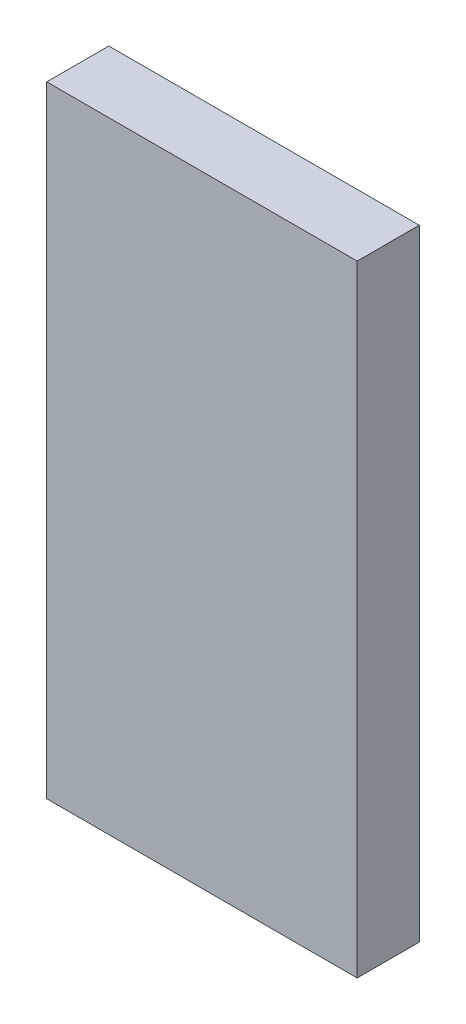
ISO-10303-21;
HEADER;
FILE_DESCRIPTION(('STEP AP214'),'2;1');
FILE_NAME('part.step','',(''),(''),'','','');
FILE_SCHEMA(('AUTOMOTIVE_DESIGN { 1 0 10303 214 1 1 1 1 }'));
ENDSEC;
DATA;
#1=APPLICATION_CONTEXT('core data for automotive mechanical design processes');
#2=APPLICATION_PROTOCOL_DEFINITION('international standard','automotive_design',2000,#1);
#3=PRODUCT_CONTEXT('',#1,'mechanical');
#4=PRODUCT('Part','Part','',(#3));
#5=PRODUCT_RELATED_PRODUCT_CATEGORY('part','',(#4));
#6=PRODUCT_DEFINITION_FORMATION('','',#4);
#7=PRODUCT_DEFINITION_CONTEXT('part definition',#1,'design');
#8=PRODUCT_DEFINITION('design','',#6,#7);
#9=PRODUCT_DEFINITION_SHAPE('','',#8);
#10=(LENGTH_UNIT() NAMED_UNIT(*) SI_UNIT(.MILLI.,.METRE.));
#11=(NAMED_UNIT(*) PLANE_ANGLE_UNIT() SI_UNIT($,.RADIAN.));
#12=(NAMED_UNIT(*) SI_UNIT($,.STERADIAN.) SOLID_ANGLE_UNIT());
#13=UNCERTAINTY_MEASURE_WITH_UNIT(LENGTH_MEASURE(1.E-05),#10,'distance_accuracy_value','');
#14=(GEOMETRIC_REPRESENTATION_CONTEXT(3) GLOBAL_UNCERTAINTY_ASSIGNED_CONTEXT((#13)) GLOBAL_UNIT_ASSIGNED_CONTEXT((#10,
#11,#12)) REPRESENTATION_CONTEXT('',''));
#15=CARTESIAN_POINT('',(0.,0.,0.));
#16=DIRECTION('',(0.,0.,1.));
#17=DIRECTION('',(1.,0.,0.));
#18=AXIS2_PLACEMENT_3D('',#15,#16,#17);
#19=CARTESIAN_POINT('',(30.,-60.,6.));
#20=DIRECTION('',(-1.,0.,0.));
#21=DIRECTION('',(0.,0.,1.));
#22=AXIS2_PLACEMENT_3D('',#19,#20,#21);
#23=PLANE('',#22);
#24=DIRECTION('',(0.,1.,0.));
#25=VECTOR('',#24,1.);
#26=CARTESIAN_POINT('',(30.,-60.,-6.));
#27=LINE('',#26,#25);
#28=CARTESIAN_POINT('',(30.,-60.,-6.));
#29=VERTEX_POINT('',#28);
#30=CARTESIAN_POINT('',(30.,60.,-6.));
#31=VERTEX_POINT('',#30);
#32=EDGE_CURVE('E102',#29,#31,#27,.T.);
#33=ORIENTED_EDGE('',*,*,#32,.T.);
#34=DIRECTION('',(0.,0.,-1.));
#35=VECTOR('',#34,1.);
#36=CARTESIAN_POINT('',(30.,60.,6.));
#37=LINE('',#36,#35);
#38=CARTESIAN_POINT('',(30.,60.,6.));
#39=VERTEX_POINT('',#38);
#40=EDGE_CURVE('E11',#39,#31,#37,.T.);
#41=ORIENTED_EDGE('',*,*,#40,.F.);
#42=DIRECTION('',(0.,1.,0.));
#43=VECTOR('',#42,1.);
#44=CARTESIAN_POINT('',(30.,-60.,6.));
#45=LINE('',#44,#43);
#46=CARTESIAN_POINT('',(30.,-60.,6.));
#47=VERTEX_POINT('',#46);
#48=EDGE_CURVE('E90',#47,#39,#45,.T.);
#49=ORIENTED_EDGE('',*,*,#48,.F.);
#50=DIRECTION('',(0.,0.,-1.));
#51=VECTOR('',#50,1.);
#52=CARTESIAN_POINT('',(30.,-60.,6.));
#53=LINE('',#52,#51);
#54=EDGE_CURVE('E98',#47,#29,#53,.T.);
#55=ORIENTED_EDGE('',*,*,#54,.T.);
#56=EDGE_LOOP('',(#33,#41,#49,#55));
#57=FACE_BOUND('',#56,.T.);
#58=ADVANCED_FACE('F39',(#57),#23,.F.);
#59=CARTESIAN_POINT('',(-30.,60.,6.));
#60=DIRECTION('',(0.,-1.,0.));
#61=DIRECTION('',(0.,0.,-1.));
#62=AXIS2_PLACEMENT_3D('',#59,#60,#61);
#63=PLANE('',#62);
#64=DIRECTION('',(-1.,0.,0.));
#65=VECTOR('',#64,1.);
#66=CARTESIAN_POINT('',(-30.,60.,-6.));
#67=LINE('',#66,#65);
#68=CARTESIAN_POINT('',(-30.,60.,-6.));
#69=VERTEX_POINT('',#68);
#70=EDGE_CURVE('E94',#31,#69,#67,.T.);
#71=ORIENTED_EDGE('',*,*,#70,.T.);
#72=DIRECTION('',(0.,0.,-1.));
#73=VECTOR('',#72,1.);
#74=CARTESIAN_POINT('',(-30.,60.,6.));
#75=LINE('',#74,#73);
#76=CARTESIAN_POINT('',(-30.,60.,6.));
#77=VERTEX_POINT('',#76);
#78=EDGE_CURVE('E47',#77,#69,#75,.T.);
#79=ORIENTED_EDGE('',*,*,#78,.F.);
#80=DIRECTION('',(-1.,0.,0.));
#81=VECTOR('',#80,1.);
#82=CARTESIAN_POINT('',(-30.,60.,6.));
#83=LINE('',#82,#81);
#84=EDGE_CURVE('E85',#39,#77,#83,.T.);
#85=ORIENTED_EDGE('',*,*,#84,.F.);
#86=ORIENTED_EDGE('',*,*,#40,.T.);
#87=EDGE_LOOP('',(#71,#79,#85,#86));
#88=FACE_BOUND('',#87,.T.);
#89=ADVANCED_FACE('F93',(#88),#63,.F.);
#90=CARTESIAN_POINT('',(-30.,-60.,6.));
#91=DIRECTION('',(1.,0.,0.));
#92=DIRECTION('',(0.,0.,-1.));
#93=AXIS2_PLACEMENT_3D('',#90,#91,#92);
#94=PLANE('',#93);
#95=DIRECTION('',(0.,-1.,0.));
#96=VECTOR('',#95,1.);
#97=CARTESIAN_POINT('',(-30.,-60.,-6.));
#98=LINE('',#97,#96);
#99=CARTESIAN_POINT('',(-30.,-60.,-6.));
#100=VERTEX_POINT('',#99);
#101=EDGE_CURVE('E72',#69,#100,#98,.T.);
#102=ORIENTED_EDGE('',*,*,#101,.T.);
#103=DIRECTION('',(0.,0.,-1.));
#104=VECTOR('',#103,1.);
#105=CARTESIAN_POINT('',(-30.,-60.,6.));
#106=LINE('',#105,#104);
#107=CARTESIAN_POINT('',(-30.,-60.,6.));
#108=VERTEX_POINT('',#107);
#109=EDGE_CURVE('E95',#108,#100,#106,.T.);
#110=ORIENTED_EDGE('',*,*,#109,.F.);
#111=DIRECTION('',(0.,-1.,0.));
#112=VECTOR('',#111,1.);
#113=CARTESIAN_POINT('',(-30.,-60.,6.));
#114=LINE('',#113,#112);
#115=EDGE_CURVE('E88',#77,#108,#114,.T.);
#116=ORIENTED_EDGE('',*,*,#115,.F.);
#117=ORIENTED_EDGE('',*,*,#78,.T.);
#118=EDGE_LOOP('',(#102,#110,#116,#117));
#119=FACE_BOUND('',#118,.T.);
#120=ADVANCED_FACE('F96',(#119),#94,.F.);
#121=CARTESIAN_POINT('',(-30.,-60.,6.));
#122=DIRECTION('',(0.,1.,0.));
#123=DIRECTION('',(0.,0.,1.));
#124=AXIS2_PLACEMENT_3D('',#121,#122,#123);
#125=PLANE('',#124);
#126=DIRECTION('',(1.,0.,0.));
#127=VECTOR('',#126,1.);
#128=CARTESIAN_POINT('',(-30.,-60.,-6.));
#129=LINE('',#128,#127);
#130=EDGE_CURVE('E78',#100,#29,#129,.T.);
#131=ORIENTED_EDGE('',*,*,#130,.T.);
#132=ORIENTED_EDGE('',*,*,#54,.F.);
#133=DIRECTION('',(1.,0.,0.));
#134=VECTOR('',#133,1.);
#135=CARTESIAN_POINT('',(-30.,-60.,6.));
#136=LINE('',#135,#134);
#137=EDGE_CURVE('E55',#108,#47,#136,.T.);
#138=ORIENTED_EDGE('',*,*,#137,.F.);
#139=ORIENTED_EDGE('',*,*,#109,.T.);
#140=EDGE_LOOP('',(#131,#132,#138,#139));
#141=FACE_BOUND('',#140,.T.);
#142=ADVANCED_FACE('F109',(#141),#125,.F.);
#143=CARTESIAN_POINT('',(0.,0.,6.));
#144=DIRECTION('',(0.,0.,-1.));
#145=DIRECTION('',(-1.,0.,0.));
#146=AXIS2_PLACEMENT_3D('',#143,#144,#145);
#147=PLANE('',#146);
#148=ORIENTED_EDGE('',*,*,#48,.T.);
#149=ORIENTED_EDGE('',*,*,#84,.T.);
#150=ORIENTED_EDGE('',*,*,#115,.T.);
#151=ORIENTED_EDGE('',*,*,#137,.T.);
#152=EDGE_LOOP('',(#148,#149,#150,#151));
#153=FACE_BOUND('',#152,.T.);
#154=ADVANCED_FACE('F86',(#153),#147,.F.);
#155=CARTESIAN_POINT('',(0.,0.,-6.));
#156=DIRECTION('',(0.,0.,-1.));
#157=DIRECTION('',(-1.,0.,0.));
#158=AXIS2_PLACEMENT_3D('',#155,#156,#157);
#159=PLANE('',#158);
#160=ORIENTED_EDGE('',*,*,#32,.F.);
#161=ORIENTED_EDGE('',*,*,#130,.F.);
#162=ORIENTED_EDGE('',*,*,#101,.F.);
#163=ORIENTED_EDGE('',*,*,#70,.F.);
#164=EDGE_LOOP('',(#160,#161,#162,#163));
#165=FACE_BOUND('',#164,.T.);
#166=ADVANCED_FACE('F112',(#165),#159,.T.);
#167=CLOSED_SHELL('',(#58,#89,#120,#142,#154,#166));
#168=MANIFOLD_SOLID_BREP('B2',#167);
#169=ADVANCED_BREP_SHAPE_REPRESENTATION('',(#18,#168),#14);
#170=SHAPE_DEFINITION_REPRESENTATION(#9,#169);
ENDSEC;
END-ISO-10303-21;
